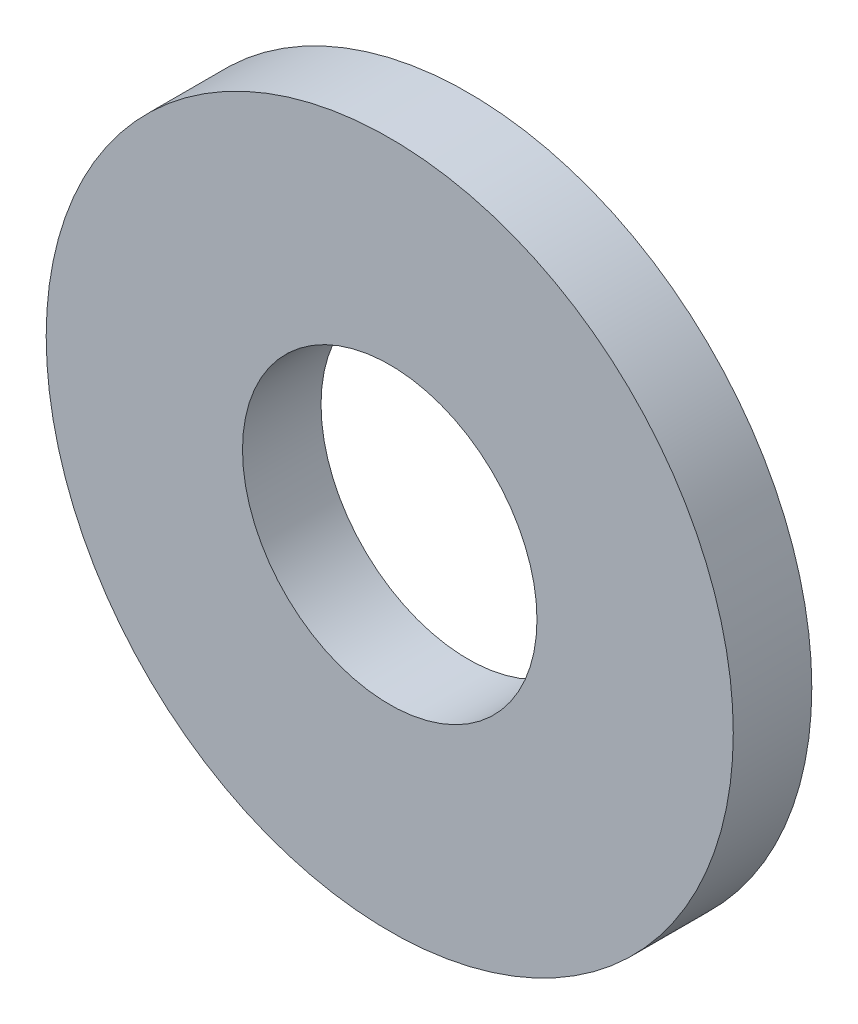
ISO-10303-21;
HEADER;
FILE_DESCRIPTION(('STEP AP214'),'2;1');
FILE_NAME('part.step','',(''),(''),'','','');
FILE_SCHEMA(('AUTOMOTIVE_DESIGN { 1 0 10303 214 1 1 1 1 }'));
ENDSEC;
DATA;
#1=APPLICATION_CONTEXT('core data for automotive mechanical design processes');
#2=APPLICATION_PROTOCOL_DEFINITION('international standard','automotive_design',2000,#1);
#3=PRODUCT_CONTEXT('',#1,'mechanical');
#4=PRODUCT('Part','Part','',(#3));
#5=PRODUCT_RELATED_PRODUCT_CATEGORY('part','',(#4));
#6=PRODUCT_DEFINITION_FORMATION('','',#4);
#7=PRODUCT_DEFINITION_CONTEXT('part definition',#1,'design');
#8=PRODUCT_DEFINITION('design','',#6,#7);
#9=PRODUCT_DEFINITION_SHAPE('','',#8);
#10=(LENGTH_UNIT() NAMED_UNIT(*) SI_UNIT(.MILLI.,.METRE.));
#11=(NAMED_UNIT(*) PLANE_ANGLE_UNIT() SI_UNIT($,.RADIAN.));
#12=(NAMED_UNIT(*) SI_UNIT($,.STERADIAN.) SOLID_ANGLE_UNIT());
#13=UNCERTAINTY_MEASURE_WITH_UNIT(LENGTH_MEASURE(1.E-05),#10,'distance_accuracy_value','');
#14=(GEOMETRIC_REPRESENTATION_CONTEXT(3) GLOBAL_UNCERTAINTY_ASSIGNED_CONTEXT((#13)) GLOBAL_UNIT_ASSIGNED_CONTEXT((#10,
#11,#12)) REPRESENTATION_CONTEXT('',''));
#15=CARTESIAN_POINT('',(0.,0.,0.));
#16=DIRECTION('',(0.,0.,1.));
#17=DIRECTION('',(1.,0.,0.));
#18=AXIS2_PLACEMENT_3D('',#15,#16,#17);
#19=CARTESIAN_POINT('',(0.,0.,1.27));
#20=DIRECTION('',(0.,0.,1.));
#21=DIRECTION('',(1.,0.,0.));
#22=AXIS2_PLACEMENT_3D('',#19,#20,#21);
#23=PLANE('',#22);
#24=CARTESIAN_POINT('',(0.,0.,1.27));
#25=DIRECTION('',(0.,0.,1.));
#26=DIRECTION('',(1.,0.,0.));
#27=AXIS2_PLACEMENT_3D('',#24,#25,#26);
#28=CIRCLE('',#27,11.1125);
#29=CARTESIAN_POINT('',(11.1125,0.,1.27));
#30=VERTEX_POINT('',#29);
#31=EDGE_CURVE('E10',#30,#30,#28,.T.);
#32=ORIENTED_EDGE('',*,*,#31,.T.);
#33=EDGE_LOOP('',(#32));
#34=FACE_BOUND('',#33,.T.);
#35=CARTESIAN_POINT('',(0.,0.,1.27));
#36=DIRECTION('',(0.,0.,1.));
#37=DIRECTION('',(1.,0.,0.));
#38=AXIS2_PLACEMENT_3D('',#35,#36,#37);
#39=CIRCLE('',#38,4.7625);
#40=CARTESIAN_POINT('',(4.7625,0.,1.27));
#41=VERTEX_POINT('',#40);
#42=EDGE_CURVE('E43',#41,#41,#39,.T.);
#43=ORIENTED_EDGE('',*,*,#42,.F.);
#44=EDGE_LOOP('',(#43));
#45=FACE_BOUND('',#44,.T.);
#46=ADVANCED_FACE('F32',(#34,#45),#23,.T.);
#47=CARTESIAN_POINT('',(0.,0.,-1.27));
#48=DIRECTION('',(0.,0.,1.));
#49=DIRECTION('',(1.,0.,0.));
#50=AXIS2_PLACEMENT_3D('',#47,#48,#49);
#51=PLANE('',#50);
#52=CARTESIAN_POINT('',(0.,0.,-1.27));
#53=DIRECTION('',(0.,0.,1.));
#54=DIRECTION('',(1.,0.,0.));
#55=AXIS2_PLACEMENT_3D('',#52,#53,#54);
#56=CIRCLE('',#55,11.1125);
#57=CARTESIAN_POINT('',(11.1125,0.,-1.27));
#58=VERTEX_POINT('',#57);
#59=EDGE_CURVE('E36',#58,#58,#56,.T.);
#60=ORIENTED_EDGE('',*,*,#59,.F.);
#61=EDGE_LOOP('',(#60));
#62=FACE_BOUND('',#61,.T.);
#63=CARTESIAN_POINT('',(0.,0.,-1.27));
#64=DIRECTION('',(0.,0.,1.));
#65=DIRECTION('',(1.,0.,0.));
#66=AXIS2_PLACEMENT_3D('',#63,#64,#65);
#67=CIRCLE('',#66,4.7625);
#68=CARTESIAN_POINT('',(4.7625,0.,-1.27));
#69=VERTEX_POINT('',#68);
#70=EDGE_CURVE('E45',#69,#69,#67,.T.);
#71=ORIENTED_EDGE('',*,*,#70,.T.);
#72=EDGE_LOOP('',(#71));
#73=FACE_BOUND('',#72,.T.);
#74=ADVANCED_FACE('F55',(#62,#73),#51,.F.);
#75=CARTESIAN_POINT('',(0.,0.,1.27));
#76=DIRECTION('',(0.,0.,-1.));
#77=DIRECTION('',(-1.,0.,0.));
#78=AXIS2_PLACEMENT_3D('',#75,#76,#77);
#79=CYLINDRICAL_SURFACE('',#78,11.1125);
#80=ORIENTED_EDGE('',*,*,#31,.F.);
#81=EDGE_LOOP('',(#80));
#82=FACE_BOUND('',#81,.T.);
#83=ORIENTED_EDGE('',*,*,#59,.T.);
#84=EDGE_LOOP('',(#83));
#85=FACE_BOUND('',#84,.T.);
#86=ADVANCED_FACE('F34',(#82,#85),#79,.T.);
#87=CARTESIAN_POINT('',(0.,0.,1.27));
#88=DIRECTION('',(0.,0.,-1.));
#89=DIRECTION('',(-1.,0.,0.));
#90=AXIS2_PLACEMENT_3D('',#87,#88,#89);
#91=CYLINDRICAL_SURFACE('',#90,4.7625);
#92=ORIENTED_EDGE('',*,*,#42,.T.);
#93=EDGE_LOOP('',(#92));
#94=FACE_BOUND('',#93,.T.);
#95=ORIENTED_EDGE('',*,*,#70,.F.);
#96=EDGE_LOOP('',(#95));
#97=FACE_BOUND('',#96,.T.);
#98=ADVANCED_FACE('F51',(#94,#97),#91,.F.);
#99=CLOSED_SHELL('',(#46,#74,#86,#98));
#100=MANIFOLD_SOLID_BREP('B2',#99);
#101=ADVANCED_BREP_SHAPE_REPRESENTATION('',(#18,#100),#14);
#102=SHAPE_DEFINITION_REPRESENTATION(#9,#101);
ENDSEC;
END-ISO-10303-21;
